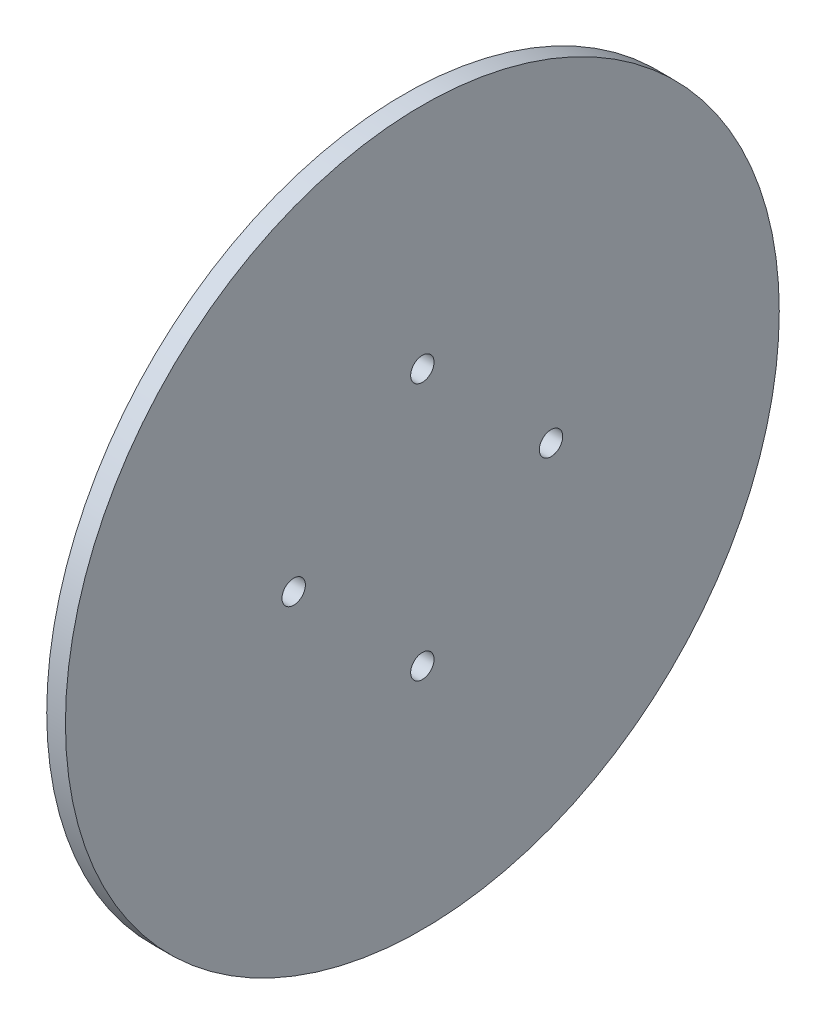
ISO-10303-21;
HEADER;
FILE_DESCRIPTION(('STEP AP214'),'2;1');
FILE_NAME('part.step','',(''),(''),'','','');
FILE_SCHEMA(('AUTOMOTIVE_DESIGN { 1 0 10303 214 1 1 1 1 }'));
ENDSEC;
DATA;
#1=APPLICATION_CONTEXT('core data for automotive mechanical design processes');
#2=APPLICATION_PROTOCOL_DEFINITION('international standard','automotive_design',2000,#1);
#3=PRODUCT_CONTEXT('',#1,'mechanical');
#4=PRODUCT('Part','Part','',(#3));
#5=PRODUCT_RELATED_PRODUCT_CATEGORY('part','',(#4));
#6=PRODUCT_DEFINITION_FORMATION('','',#4);
#7=PRODUCT_DEFINITION_CONTEXT('part definition',#1,'design');
#8=PRODUCT_DEFINITION('design','',#6,#7);
#9=PRODUCT_DEFINITION_SHAPE('','',#8);
#10=(LENGTH_UNIT() NAMED_UNIT(*) SI_UNIT(.MILLI.,.METRE.));
#11=(NAMED_UNIT(*) PLANE_ANGLE_UNIT() SI_UNIT($,.RADIAN.));
#12=(NAMED_UNIT(*) SI_UNIT($,.STERADIAN.) SOLID_ANGLE_UNIT());
#13=UNCERTAINTY_MEASURE_WITH_UNIT(LENGTH_MEASURE(1.E-05),#10,'distance_accuracy_value','');
#14=(GEOMETRIC_REPRESENTATION_CONTEXT(3) GLOBAL_UNCERTAINTY_ASSIGNED_CONTEXT((#13)) GLOBAL_UNIT_ASSIGNED_CONTEXT((#10,
#11,#12)) REPRESENTATION_CONTEXT('',''));
#15=CARTESIAN_POINT('',(0.,0.,0.));
#16=DIRECTION('',(0.,0.,1.));
#17=DIRECTION('',(1.,0.,0.));
#18=AXIS2_PLACEMENT_3D('',#15,#16,#17);
#19=CARTESIAN_POINT('',(4.,0.,0.));
#20=DIRECTION('',(1.,0.,0.));
#21=DIRECTION('',(0.,0.,-1.));
#22=AXIS2_PLACEMENT_3D('',#19,#20,#21);
#23=PLANE('',#22);
#24=CARTESIAN_POINT('',(4.,-27.5,0.));
#25=DIRECTION('',(1.,0.,0.));
#26=DIRECTION('',(0.,0.,-1.));
#27=AXIS2_PLACEMENT_3D('',#24,#25,#26);
#28=CIRCLE('',#27,2.5);
#29=CARTESIAN_POINT('',(4.,-27.5,-2.5));
#30=VERTEX_POINT('',#29);
#31=EDGE_CURVE('E56',#30,#30,#28,.T.);
#32=ORIENTED_EDGE('',*,*,#31,.F.);
#33=EDGE_LOOP('',(#32));
#34=FACE_BOUND('',#33,.T.);
#35=CARTESIAN_POINT('',(4.,27.5,0.));
#36=DIRECTION('',(1.,0.,0.));
#37=DIRECTION('',(0.,0.,-1.));
#38=AXIS2_PLACEMENT_3D('',#35,#36,#37);
#39=CIRCLE('',#38,2.5);
#40=CARTESIAN_POINT('',(4.,27.5,-2.5));
#41=VERTEX_POINT('',#40);
#42=EDGE_CURVE('E45',#41,#41,#39,.T.);
#43=ORIENTED_EDGE('',*,*,#42,.F.);
#44=EDGE_LOOP('',(#43));
#45=FACE_BOUND('',#44,.T.);
#46=CARTESIAN_POINT('',(4.,0.,0.));
#47=DIRECTION('',(1.,0.,0.));
#48=DIRECTION('',(0.,0.,-1.));
#49=AXIS2_PLACEMENT_3D('',#46,#47,#48);
#50=CIRCLE('',#49,76.29);
#51=CARTESIAN_POINT('',(4.,0.,-76.29));
#52=VERTEX_POINT('',#51);
#53=EDGE_CURVE('E10',#52,#52,#50,.T.);
#54=ORIENTED_EDGE('',*,*,#53,.T.);
#55=EDGE_LOOP('',(#54));
#56=FACE_BOUND('',#55,.T.);
#57=CARTESIAN_POINT('',(4.,0.,-27.5));
#58=DIRECTION('',(1.,0.,0.));
#59=DIRECTION('',(0.,0.,-1.));
#60=AXIS2_PLACEMENT_3D('',#57,#58,#59);
#61=CIRCLE('',#60,2.5);
#62=CARTESIAN_POINT('',(4.,0.,-30.));
#63=VERTEX_POINT('',#62);
#64=EDGE_CURVE('E50',#63,#63,#61,.T.);
#65=ORIENTED_EDGE('',*,*,#64,.F.);
#66=EDGE_LOOP('',(#65));
#67=FACE_BOUND('',#66,.T.);
#68=CARTESIAN_POINT('',(4.,0.,27.5));
#69=DIRECTION('',(1.,0.,0.));
#70=DIRECTION('',(0.,0.,-1.));
#71=AXIS2_PLACEMENT_3D('',#68,#69,#70);
#72=CIRCLE('',#71,2.5);
#73=CARTESIAN_POINT('',(4.,0.,25.));
#74=VERTEX_POINT('',#73);
#75=EDGE_CURVE('E62',#74,#74,#72,.T.);
#76=ORIENTED_EDGE('',*,*,#75,.F.);
#77=EDGE_LOOP('',(#76));
#78=FACE_BOUND('',#77,.T.);
#79=ADVANCED_FACE('F34',(#34,#45,#56,#67,#78),#23,.T.);
#80=CARTESIAN_POINT('',(0.,0.,0.));
#81=DIRECTION('',(1.,0.,0.));
#82=DIRECTION('',(0.,0.,-1.));
#83=AXIS2_PLACEMENT_3D('',#80,#81,#82);
#84=PLANE('',#83);
#85=CARTESIAN_POINT('',(0.,0.,0.));
#86=DIRECTION('',(1.,0.,0.));
#87=DIRECTION('',(0.,0.,-1.));
#88=AXIS2_PLACEMENT_3D('',#85,#86,#87);
#89=CIRCLE('',#88,76.29);
#90=CARTESIAN_POINT('',(0.,0.,-76.29));
#91=VERTEX_POINT('',#90);
#92=EDGE_CURVE('E38',#91,#91,#89,.T.);
#93=ORIENTED_EDGE('',*,*,#92,.F.);
#94=EDGE_LOOP('',(#93));
#95=FACE_BOUND('',#94,.T.);
#96=CARTESIAN_POINT('',(0.,27.5,0.));
#97=DIRECTION('',(1.,0.,0.));
#98=DIRECTION('',(0.,0.,-1.));
#99=AXIS2_PLACEMENT_3D('',#96,#97,#98);
#100=CIRCLE('',#99,2.5);
#101=CARTESIAN_POINT('',(0.,27.5,-2.5));
#102=VERTEX_POINT('',#101);
#103=EDGE_CURVE('E47',#102,#102,#100,.T.);
#104=ORIENTED_EDGE('',*,*,#103,.T.);
#105=EDGE_LOOP('',(#104));
#106=FACE_BOUND('',#105,.T.);
#107=CARTESIAN_POINT('',(0.,0.,-27.5));
#108=DIRECTION('',(1.,0.,0.));
#109=DIRECTION('',(0.,0.,-1.));
#110=AXIS2_PLACEMENT_3D('',#107,#108,#109);
#111=CIRCLE('',#110,2.5);
#112=CARTESIAN_POINT('',(0.,0.,-30.));
#113=VERTEX_POINT('',#112);
#114=EDGE_CURVE('E53',#113,#113,#111,.T.);
#115=ORIENTED_EDGE('',*,*,#114,.T.);
#116=EDGE_LOOP('',(#115));
#117=FACE_BOUND('',#116,.T.);
#118=CARTESIAN_POINT('',(0.,-27.5,0.));
#119=DIRECTION('',(1.,0.,0.));
#120=DIRECTION('',(0.,0.,-1.));
#121=AXIS2_PLACEMENT_3D('',#118,#119,#120);
#122=CIRCLE('',#121,2.5);
#123=CARTESIAN_POINT('',(0.,-27.5,-2.5));
#124=VERTEX_POINT('',#123);
#125=EDGE_CURVE('E59',#124,#124,#122,.T.);
#126=ORIENTED_EDGE('',*,*,#125,.T.);
#127=EDGE_LOOP('',(#126));
#128=FACE_BOUND('',#127,.T.);
#129=CARTESIAN_POINT('',(0.,0.,27.5));
#130=DIRECTION('',(1.,0.,0.));
#131=DIRECTION('',(0.,0.,-1.));
#132=AXIS2_PLACEMENT_3D('',#129,#130,#131);
#133=CIRCLE('',#132,2.5);
#134=CARTESIAN_POINT('',(0.,0.,25.));
#135=VERTEX_POINT('',#134);
#136=EDGE_CURVE('E65',#135,#135,#133,.T.);
#137=ORIENTED_EDGE('',*,*,#136,.T.);
#138=EDGE_LOOP('',(#137));
#139=FACE_BOUND('',#138,.T.);
#140=ADVANCED_FACE('F75',(#95,#106,#117,#128,#139),#84,.F.);
#141=CARTESIAN_POINT('',(4.,0.,0.));
#142=DIRECTION('',(-1.,0.,0.));
#143=DIRECTION('',(0.,0.,1.));
#144=AXIS2_PLACEMENT_3D('',#141,#142,#143);
#145=CYLINDRICAL_SURFACE('',#144,76.29);
#146=ORIENTED_EDGE('',*,*,#53,.F.);
#147=EDGE_LOOP('',(#146));
#148=FACE_BOUND('',#147,.T.);
#149=ORIENTED_EDGE('',*,*,#92,.T.);
#150=EDGE_LOOP('',(#149));
#151=FACE_BOUND('',#150,.T.);
#152=ADVANCED_FACE('F36',(#148,#151),#145,.T.);
#153=CARTESIAN_POINT('',(4.,27.5,0.));
#154=DIRECTION('',(-1.,0.,0.));
#155=DIRECTION('',(0.,0.,1.));
#156=AXIS2_PLACEMENT_3D('',#153,#154,#155);
#157=CYLINDRICAL_SURFACE('',#156,2.5);
#158=ORIENTED_EDGE('',*,*,#42,.T.);
#159=EDGE_LOOP('',(#158));
#160=FACE_BOUND('',#159,.T.);
#161=ORIENTED_EDGE('',*,*,#103,.F.);
#162=EDGE_LOOP('',(#161));
#163=FACE_BOUND('',#162,.T.);
#164=ADVANCED_FACE('F85',(#160,#163),#157,.F.);
#165=CARTESIAN_POINT('',(4.,0.,-27.5));
#166=DIRECTION('',(-1.,0.,0.));
#167=DIRECTION('',(0.,0.,1.));
#168=AXIS2_PLACEMENT_3D('',#165,#166,#167);
#169=CYLINDRICAL_SURFACE('',#168,2.5);
#170=ORIENTED_EDGE('',*,*,#64,.T.);
#171=EDGE_LOOP('',(#170));
#172=FACE_BOUND('',#171,.T.);
#173=ORIENTED_EDGE('',*,*,#114,.F.);
#174=EDGE_LOOP('',(#173));
#175=FACE_BOUND('',#174,.T.);
#176=ADVANCED_FACE('F88',(#172,#175),#169,.F.);
#177=CARTESIAN_POINT('',(4.,-27.5,0.));
#178=DIRECTION('',(-1.,0.,0.));
#179=DIRECTION('',(0.,0.,1.));
#180=AXIS2_PLACEMENT_3D('',#177,#178,#179);
#181=CYLINDRICAL_SURFACE('',#180,2.5);
#182=ORIENTED_EDGE('',*,*,#31,.T.);
#183=EDGE_LOOP('',(#182));
#184=FACE_BOUND('',#183,.T.);
#185=ORIENTED_EDGE('',*,*,#125,.F.);
#186=EDGE_LOOP('',(#185));
#187=FACE_BOUND('',#186,.T.);
#188=ADVANCED_FACE('F92',(#184,#187),#181,.F.);
#189=CARTESIAN_POINT('',(4.,0.,27.5));
#190=DIRECTION('',(-1.,0.,0.));
#191=DIRECTION('',(0.,0.,1.));
#192=AXIS2_PLACEMENT_3D('',#189,#190,#191);
#193=CYLINDRICAL_SURFACE('',#192,2.5);
#194=ORIENTED_EDGE('',*,*,#75,.T.);
#195=EDGE_LOOP('',(#194));
#196=FACE_BOUND('',#195,.T.);
#197=ORIENTED_EDGE('',*,*,#136,.F.);
#198=EDGE_LOOP('',(#197));
#199=FACE_BOUND('',#198,.T.);
#200=ADVANCED_FACE('F71',(#196,#199),#193,.F.);
#201=CLOSED_SHELL('',(#79,#140,#152,#164,#176,#188,#200));
#202=MANIFOLD_SOLID_BREP('B2',#201);
#203=ADVANCED_BREP_SHAPE_REPRESENTATION('',(#18,#202),#14);
#204=SHAPE_DEFINITION_REPRESENTATION(#9,#203);
ENDSEC;
END-ISO-10303-21;
